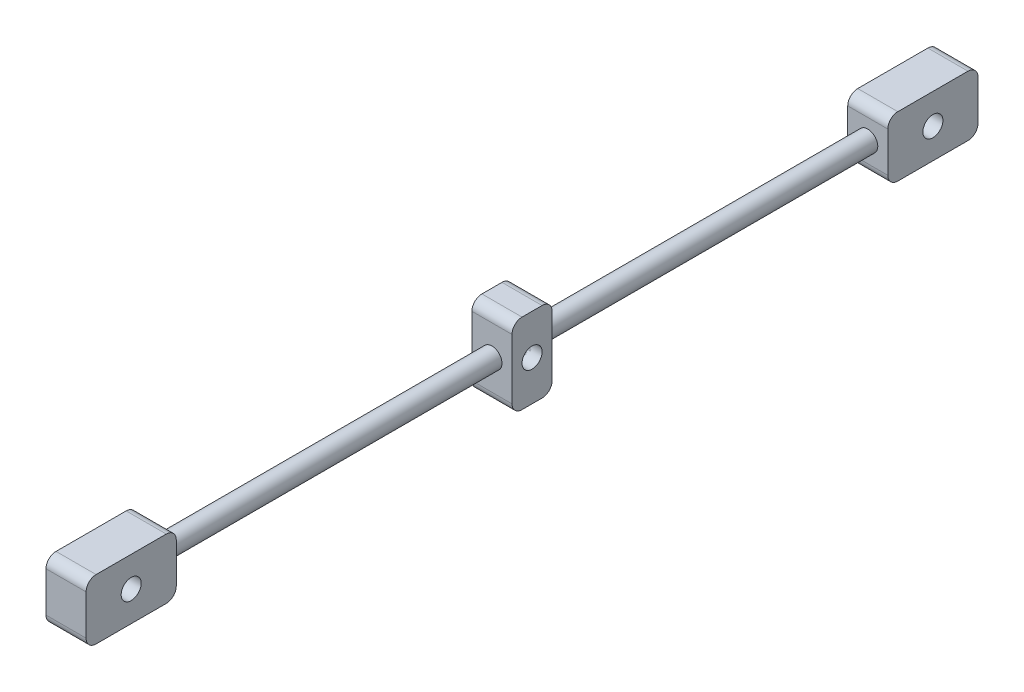
ISO-10303-21;
HEADER;
FILE_DESCRIPTION(('STEP AP214'),'2;1');
FILE_NAME('part.step','',(''),(''),'','','');
FILE_SCHEMA(('AUTOMOTIVE_DESIGN { 1 0 10303 214 1 1 1 1 }'));
ENDSEC;
DATA;
#1=APPLICATION_CONTEXT('core data for automotive mechanical design processes');
#2=APPLICATION_PROTOCOL_DEFINITION('international standard','automotive_design',2000,#1);
#3=PRODUCT_CONTEXT('',#1,'mechanical');
#4=PRODUCT('Part','Part','',(#3));
#5=PRODUCT_RELATED_PRODUCT_CATEGORY('part','',(#4));
#6=PRODUCT_DEFINITION_FORMATION('','',#4);
#7=PRODUCT_DEFINITION_CONTEXT('part definition',#1,'design');
#8=PRODUCT_DEFINITION('design','',#6,#7);
#9=PRODUCT_DEFINITION_SHAPE('','',#8);
#10=(LENGTH_UNIT() NAMED_UNIT(*) SI_UNIT(.MILLI.,.METRE.));
#11=(NAMED_UNIT(*) PLANE_ANGLE_UNIT() SI_UNIT($,.RADIAN.));
#12=(NAMED_UNIT(*) SI_UNIT($,.STERADIAN.) SOLID_ANGLE_UNIT());
#13=UNCERTAINTY_MEASURE_WITH_UNIT(LENGTH_MEASURE(1.E-05),#10,'distance_accuracy_value','');
#14=(GEOMETRIC_REPRESENTATION_CONTEXT(3) GLOBAL_UNCERTAINTY_ASSIGNED_CONTEXT((#13)) GLOBAL_UNIT_ASSIGNED_CONTEXT((#10,
#11,#12)) REPRESENTATION_CONTEXT('',''));
#15=CARTESIAN_POINT('',(0.,0.,0.));
#16=DIRECTION('',(0.,0.,1.));
#17=DIRECTION('',(1.,0.,0.));
#18=AXIS2_PLACEMENT_3D('',#15,#16,#17);
#19=CARTESIAN_POINT('',(0.,0.,400.));
#20=DIRECTION('',(0.,0.,-1.));
#21=DIRECTION('',(-1.,0.,0.));
#22=AXIS2_PLACEMENT_3D('',#19,#20,#21);
#23=CYLINDRICAL_SURFACE('',#22,10.);
#24=CARTESIAN_POINT('',(0.,0.,0.));
#25=DIRECTION('',(0.707106781186547,0.,-0.707106781186547));
#26=DIRECTION('',(-0.707106781186547,0.,-0.707106781186547));
#27=AXIS2_PLACEMENT_3D('',#24,#25,#26);
#28=ELLIPSE('',#27,14.1421356237309,10.);
#29=CARTESIAN_POINT('',(0.,-10.,0.));
#30=VERTEX_POINT('',#29);
#31=CARTESIAN_POINT('',(0.,10.,0.));
#32=VERTEX_POINT('',#31);
#33=EDGE_CURVE('E120',#30,#32,#28,.T.);
#34=ORIENTED_EDGE('',*,*,#33,.T.);
#35=CARTESIAN_POINT('',(0.,0.,0.));
#36=DIRECTION('',(-0.707106781186547,0.,-0.707106781186547));
#37=DIRECTION('',(0.707106781186547,0.,-0.707106781186547));
#38=AXIS2_PLACEMENT_3D('',#35,#36,#37);
#39=ELLIPSE('',#38,14.1421356237309,10.);
#40=EDGE_CURVE('E121',#32,#30,#39,.T.);
#41=ORIENTED_EDGE('',*,*,#40,.T.);
#42=EDGE_LOOP('',(#34,#41));
#43=FACE_BOUND('',#42,.T.);
#44=CARTESIAN_POINT('',(0.,0.,-355.));
#45=DIRECTION('',(0.,0.,1.));
#46=DIRECTION('',(1.,0.,0.));
#47=AXIS2_PLACEMENT_3D('',#44,#45,#46);
#48=CIRCLE('',#47,10.);
#49=CARTESIAN_POINT('',(10.,0.,-355.));
#50=VERTEX_POINT('',#49);
#51=EDGE_CURVE('E130',#50,#50,#48,.T.);
#52=ORIENTED_EDGE('',*,*,#51,.T.);
#53=EDGE_LOOP('',(#52));
#54=FACE_BOUND('',#53,.T.);
#55=ADVANCED_FACE('F47',(#43,#54),#23,.T.);
#56=CARTESIAN_POINT('',(-20.,-30.,-445.));
#57=DIRECTION('',(0.,-1.,0.));
#58=DIRECTION('',(0.,0.,-1.));
#59=AXIS2_PLACEMENT_3D('',#56,#57,#58);
#60=PLANE('',#59);
#61=DIRECTION('',(0.,0.,-1.));
#62=VECTOR('',#61,1.);
#63=CARTESIAN_POINT('',(-20.,-30.,-445.));
#64=LINE('',#63,#62);
#65=CARTESIAN_POINT('',(-20.,-30.,-365.));
#66=VERTEX_POINT('',#65);
#67=CARTESIAN_POINT('',(-20.,-30.,-435.));
#68=VERTEX_POINT('',#67);
#69=EDGE_CURVE('E128',#66,#68,#64,.T.);
#70=ORIENTED_EDGE('',*,*,#69,.T.);
#71=DIRECTION('',(1.,0.,0.));
#72=VECTOR('',#71,1.);
#73=CARTESIAN_POINT('',(-20.,-30.,-435.));
#74=LINE('',#73,#72);
#75=CARTESIAN_POINT('',(20.,-30.,-435.));
#76=VERTEX_POINT('',#75);
#77=EDGE_CURVE('E162',#68,#76,#74,.T.);
#78=ORIENTED_EDGE('',*,*,#77,.T.);
#79=DIRECTION('',(0.,0.,-1.));
#80=VECTOR('',#79,1.);
#81=CARTESIAN_POINT('',(20.,-30.,-445.));
#82=LINE('',#81,#80);
#83=CARTESIAN_POINT('',(20.,-30.,-365.));
#84=VERTEX_POINT('',#83);
#85=EDGE_CURVE('E148',#84,#76,#82,.T.);
#86=ORIENTED_EDGE('',*,*,#85,.F.);
#87=DIRECTION('',(1.,0.,0.));
#88=VECTOR('',#87,1.);
#89=CARTESIAN_POINT('',(-20.,-30.,-365.));
#90=LINE('',#89,#88);
#91=EDGE_CURVE('E161',#84,#66,#90,.F.);
#92=ORIENTED_EDGE('',*,*,#91,.T.);
#93=EDGE_LOOP('',(#70,#78,#86,#92));
#94=FACE_BOUND('',#93,.T.);
#95=ADVANCED_FACE('F218',(#94),#60,.T.);
#96=CARTESIAN_POINT('',(-20.,30.,-355.));
#97=DIRECTION('',(0.,0.,1.));
#98=DIRECTION('',(1.,0.,0.));
#99=AXIS2_PLACEMENT_3D('',#96,#97,#98);
#100=PLANE('',#99);
#101=ORIENTED_EDGE('',*,*,#51,.F.);
#102=EDGE_LOOP('',(#101));
#103=FACE_BOUND('',#102,.T.);
#104=DIRECTION('',(0.,-1.,0.));
#105=VECTOR('',#104,1.);
#106=CARTESIAN_POINT('',(20.,30.,-355.));
#107=LINE('',#106,#105);
#108=CARTESIAN_POINT('',(20.,20.,-355.));
#109=VERTEX_POINT('',#108);
#110=CARTESIAN_POINT('',(20.,-20.,-355.));
#111=VERTEX_POINT('',#110);
#112=EDGE_CURVE('E138',#109,#111,#107,.T.);
#113=ORIENTED_EDGE('',*,*,#112,.F.);
#114=DIRECTION('',(1.,0.,0.));
#115=VECTOR('',#114,1.);
#116=CARTESIAN_POINT('',(-20.,20.,-355.));
#117=LINE('',#116,#115);
#118=CARTESIAN_POINT('',(-20.,20.,-355.));
#119=VERTEX_POINT('',#118);
#120=EDGE_CURVE('E12',#109,#119,#117,.F.);
#121=ORIENTED_EDGE('',*,*,#120,.T.);
#122=DIRECTION('',(0.,-1.,0.));
#123=VECTOR('',#122,1.);
#124=CARTESIAN_POINT('',(-20.,30.,-355.));
#125=LINE('',#124,#123);
#126=CARTESIAN_POINT('',(-20.,-20.,-355.));
#127=VERTEX_POINT('',#126);
#128=EDGE_CURVE('E136',#119,#127,#125,.T.);
#129=ORIENTED_EDGE('',*,*,#128,.T.);
#130=DIRECTION('',(1.,0.,0.));
#131=VECTOR('',#130,1.);
#132=CARTESIAN_POINT('',(-20.,-20.,-355.));
#133=LINE('',#132,#131);
#134=EDGE_CURVE('E60',#127,#111,#133,.T.);
#135=ORIENTED_EDGE('',*,*,#134,.T.);
#136=EDGE_LOOP('',(#113,#121,#129,#135));
#137=FACE_BOUND('',#136,.T.);
#138=ADVANCED_FACE('F191',(#103,#137),#100,.T.);
#139=CARTESIAN_POINT('',(-20.,30.,-445.));
#140=DIRECTION('',(0.,1.,0.));
#141=DIRECTION('',(0.,0.,1.));
#142=AXIS2_PLACEMENT_3D('',#139,#140,#141);
#143=PLANE('',#142);
#144=DIRECTION('',(0.,0.,1.));
#145=VECTOR('',#144,1.);
#146=CARTESIAN_POINT('',(20.,30.,-445.));
#147=LINE('',#146,#145);
#148=CARTESIAN_POINT('',(20.,30.,-435.));
#149=VERTEX_POINT('',#148);
#150=CARTESIAN_POINT('',(20.,30.,-365.));
#151=VERTEX_POINT('',#150);
#152=EDGE_CURVE('E151',#149,#151,#147,.T.);
#153=ORIENTED_EDGE('',*,*,#152,.F.);
#154=DIRECTION('',(1.,0.,0.));
#155=VECTOR('',#154,1.);
#156=CARTESIAN_POINT('',(-20.,30.,-435.));
#157=LINE('',#156,#155);
#158=CARTESIAN_POINT('',(-20.,30.,-435.));
#159=VERTEX_POINT('',#158);
#160=EDGE_CURVE('E72',#149,#159,#157,.F.);
#161=ORIENTED_EDGE('',*,*,#160,.T.);
#162=DIRECTION('',(0.,0.,1.));
#163=VECTOR('',#162,1.);
#164=CARTESIAN_POINT('',(-20.,30.,-445.));
#165=LINE('',#164,#163);
#166=CARTESIAN_POINT('',(-20.,30.,-365.));
#167=VERTEX_POINT('',#166);
#168=EDGE_CURVE('E143',#159,#167,#165,.T.);
#169=ORIENTED_EDGE('',*,*,#168,.T.);
#170=DIRECTION('',(1.,0.,0.));
#171=VECTOR('',#170,1.);
#172=CARTESIAN_POINT('',(-20.,30.,-365.));
#173=LINE('',#172,#171);
#174=EDGE_CURVE('E186',#167,#151,#173,.T.);
#175=ORIENTED_EDGE('',*,*,#174,.T.);
#176=EDGE_LOOP('',(#153,#161,#169,#175));
#177=FACE_BOUND('',#176,.T.);
#178=ADVANCED_FACE('F201',(#177),#143,.T.);
#179=CARTESIAN_POINT('',(-20.,30.,-445.));
#180=DIRECTION('',(0.,0.,-1.));
#181=DIRECTION('',(-1.,0.,0.));
#182=AXIS2_PLACEMENT_3D('',#179,#180,#181);
#183=PLANE('',#182);
#184=DIRECTION('',(0.,1.,0.));
#185=VECTOR('',#184,1.);
#186=CARTESIAN_POINT('',(20.,30.,-445.));
#187=LINE('',#186,#185);
#188=CARTESIAN_POINT('',(20.,-20.,-445.));
#189=VERTEX_POINT('',#188);
#190=CARTESIAN_POINT('',(20.,20.,-445.));
#191=VERTEX_POINT('',#190);
#192=EDGE_CURVE('E152',#189,#191,#187,.T.);
#193=ORIENTED_EDGE('',*,*,#192,.F.);
#194=DIRECTION('',(1.,0.,0.));
#195=VECTOR('',#194,1.);
#196=CARTESIAN_POINT('',(-20.,-20.,-445.));
#197=LINE('',#196,#195);
#198=CARTESIAN_POINT('',(-20.,-20.,-445.));
#199=VERTEX_POINT('',#198);
#200=EDGE_CURVE('E180',#189,#199,#197,.F.);
#201=ORIENTED_EDGE('',*,*,#200,.T.);
#202=DIRECTION('',(0.,1.,0.));
#203=VECTOR('',#202,1.);
#204=CARTESIAN_POINT('',(-20.,30.,-445.));
#205=LINE('',#204,#203);
#206=CARTESIAN_POINT('',(-20.,20.,-445.));
#207=VERTEX_POINT('',#206);
#208=EDGE_CURVE('E141',#199,#207,#205,.T.);
#209=ORIENTED_EDGE('',*,*,#208,.T.);
#210=DIRECTION('',(1.,0.,0.));
#211=VECTOR('',#210,1.);
#212=CARTESIAN_POINT('',(-20.,20.,-445.));
#213=LINE('',#212,#211);
#214=EDGE_CURVE('E173',#207,#191,#213,.T.);
#215=ORIENTED_EDGE('',*,*,#214,.T.);
#216=EDGE_LOOP('',(#193,#201,#209,#215));
#217=FACE_BOUND('',#216,.T.);
#218=ADVANCED_FACE('F215',(#217),#183,.T.);
#219=CARTESIAN_POINT('',(-20.,0.,0.));
#220=DIRECTION('',(1.,0.,0.));
#221=DIRECTION('',(0.,0.,-1.));
#222=AXIS2_PLACEMENT_3D('',#219,#220,#221);
#223=PLANE('',#222);
#224=CARTESIAN_POINT('',(-20.,0.,-400.));
#225=DIRECTION('',(-1.,0.,0.));
#226=DIRECTION('',(0.,0.,1.));
#227=AXIS2_PLACEMENT_3D('',#224,#225,#226);
#228=CIRCLE('',#227,10.);
#229=CARTESIAN_POINT('',(-20.,0.,-390.));
#230=VERTEX_POINT('',#229);
#231=EDGE_CURVE('E135',#230,#230,#228,.T.);
#232=ORIENTED_EDGE('',*,*,#231,.F.);
#233=EDGE_LOOP('',(#232));
#234=FACE_BOUND('',#233,.T.);
#235=ORIENTED_EDGE('',*,*,#208,.F.);
#236=CARTESIAN_POINT('',(-20.,-20.,-435.));
#237=DIRECTION('',(1.,0.,0.));
#238=DIRECTION('',(0.,0.,-1.));
#239=AXIS2_PLACEMENT_3D('',#236,#237,#238);
#240=CIRCLE('',#239,10.);
#241=EDGE_CURVE('E184',#199,#68,#240,.F.);
#242=ORIENTED_EDGE('',*,*,#241,.T.);
#243=ORIENTED_EDGE('',*,*,#69,.F.);
#244=CARTESIAN_POINT('',(-20.,-20.,-365.));
#245=DIRECTION('',(1.,0.,0.));
#246=DIRECTION('',(0.,0.,-1.));
#247=AXIS2_PLACEMENT_3D('',#244,#245,#246);
#248=CIRCLE('',#247,10.);
#249=EDGE_CURVE('E177',#66,#127,#248,.F.);
#250=ORIENTED_EDGE('',*,*,#249,.T.);
#251=ORIENTED_EDGE('',*,*,#128,.F.);
#252=CARTESIAN_POINT('',(-20.,20.,-365.));
#253=DIRECTION('',(1.,0.,0.));
#254=DIRECTION('',(0.,0.,-1.));
#255=AXIS2_PLACEMENT_3D('',#252,#253,#254);
#256=CIRCLE('',#255,10.);
#257=EDGE_CURVE('E63',#119,#167,#256,.F.);
#258=ORIENTED_EDGE('',*,*,#257,.T.);
#259=ORIENTED_EDGE('',*,*,#168,.F.);
#260=CARTESIAN_POINT('',(-20.,20.,-435.));
#261=DIRECTION('',(1.,0.,0.));
#262=DIRECTION('',(0.,0.,-1.));
#263=AXIS2_PLACEMENT_3D('',#260,#261,#262);
#264=CIRCLE('',#263,10.);
#265=EDGE_CURVE('E185',#159,#207,#264,.F.);
#266=ORIENTED_EDGE('',*,*,#265,.T.);
#267=EDGE_LOOP('',(#235,#242,#243,#250,#251,#258,#259,#266));
#268=FACE_BOUND('',#267,.T.);
#269=ADVANCED_FACE('F206',(#234,#268),#223,.F.);
#270=CARTESIAN_POINT('',(20.,0.,0.));
#271=DIRECTION('',(1.,0.,0.));
#272=DIRECTION('',(0.,0.,-1.));
#273=AXIS2_PLACEMENT_3D('',#270,#271,#272);
#274=PLANE('',#273);
#275=CARTESIAN_POINT('',(20.,0.,-400.));
#276=DIRECTION('',(1.,0.,0.));
#277=DIRECTION('',(0.,0.,-1.));
#278=AXIS2_PLACEMENT_3D('',#275,#276,#277);
#279=CIRCLE('',#278,10.);
#280=CARTESIAN_POINT('',(20.,0.,-410.));
#281=VERTEX_POINT('',#280);
#282=EDGE_CURVE('E134',#281,#281,#279,.T.);
#283=ORIENTED_EDGE('',*,*,#282,.F.);
#284=EDGE_LOOP('',(#283));
#285=FACE_BOUND('',#284,.T.);
#286=ORIENTED_EDGE('',*,*,#85,.T.);
#287=CARTESIAN_POINT('',(20.,-20.,-435.));
#288=DIRECTION('',(1.,0.,0.));
#289=DIRECTION('',(0.,0.,-1.));
#290=AXIS2_PLACEMENT_3D('',#287,#288,#289);
#291=CIRCLE('',#290,10.);
#292=EDGE_CURVE('E172',#76,#189,#291,.T.);
#293=ORIENTED_EDGE('',*,*,#292,.T.);
#294=ORIENTED_EDGE('',*,*,#192,.T.);
#295=CARTESIAN_POINT('',(20.,20.,-435.));
#296=DIRECTION('',(1.,0.,0.));
#297=DIRECTION('',(0.,0.,-1.));
#298=AXIS2_PLACEMENT_3D('',#295,#296,#297);
#299=CIRCLE('',#298,10.);
#300=EDGE_CURVE('E168',#191,#149,#299,.T.);
#301=ORIENTED_EDGE('',*,*,#300,.T.);
#302=ORIENTED_EDGE('',*,*,#152,.T.);
#303=CARTESIAN_POINT('',(20.,20.,-365.));
#304=DIRECTION('',(1.,0.,0.));
#305=DIRECTION('',(0.,0.,-1.));
#306=AXIS2_PLACEMENT_3D('',#303,#304,#305);
#307=CIRCLE('',#306,10.);
#308=EDGE_CURVE('E169',#151,#109,#307,.T.);
#309=ORIENTED_EDGE('',*,*,#308,.T.);
#310=ORIENTED_EDGE('',*,*,#112,.T.);
#311=CARTESIAN_POINT('',(20.,-20.,-365.));
#312=DIRECTION('',(1.,0.,0.));
#313=DIRECTION('',(0.,0.,-1.));
#314=AXIS2_PLACEMENT_3D('',#311,#312,#313);
#315=CIRCLE('',#314,10.);
#316=EDGE_CURVE('E167',#111,#84,#315,.T.);
#317=ORIENTED_EDGE('',*,*,#316,.T.);
#318=EDGE_LOOP('',(#286,#293,#294,#301,#302,#309,#310,#317));
#319=FACE_BOUND('',#318,.T.);
#320=ADVANCED_FACE('F196',(#285,#319),#274,.T.);
#321=CARTESIAN_POINT('',(34.,0.,-400.));
#322=DIRECTION('',(-1.,0.,0.));
#323=DIRECTION('',(0.,0.,1.));
#324=AXIS2_PLACEMENT_3D('',#321,#322,#323);
#325=CYLINDRICAL_SURFACE('',#324,10.);
#326=ORIENTED_EDGE('',*,*,#282,.T.);
#327=EDGE_LOOP('',(#326));
#328=FACE_BOUND('',#327,.T.);
#329=ORIENTED_EDGE('',*,*,#231,.T.);
#330=EDGE_LOOP('',(#329));
#331=FACE_BOUND('',#330,.T.);
#332=ADVANCED_FACE('F234',(#328,#331),#325,.F.);
#333=CARTESIAN_POINT('',(34.,0.,0.));
#334=DIRECTION('',(-1.,0.,0.));
#335=DIRECTION('',(0.,0.,1.));
#336=AXIS2_PLACEMENT_3D('',#333,#334,#335);
#337=CYLINDRICAL_SURFACE('',#336,10.);
#338=ORIENTED_EDGE('',*,*,#33,.F.);
#339=ORIENTED_EDGE('',*,*,#40,.F.);
#340=EDGE_LOOP('',(#338,#339));
#341=FACE_BOUND('',#340,.T.);
#342=ADVANCED_FACE('F125',(#341),#337,.F.);
#343=CARTESIAN_POINT('',(-20.,-20.,-435.));
#344=DIRECTION('',(1.,0.,0.));
#345=DIRECTION('',(0.,0.,-1.));
#346=AXIS2_PLACEMENT_3D('',#343,#344,#345);
#347=CYLINDRICAL_SURFACE('',#346,10.);
#348=ORIENTED_EDGE('',*,*,#241,.F.);
#349=ORIENTED_EDGE('',*,*,#200,.F.);
#350=ORIENTED_EDGE('',*,*,#292,.F.);
#351=ORIENTED_EDGE('',*,*,#77,.F.);
#352=EDGE_LOOP('',(#348,#349,#350,#351));
#353=FACE_BOUND('',#352,.T.);
#354=ADVANCED_FACE('F220',(#353),#347,.T.);
#355=CARTESIAN_POINT('',(-20.,20.,-435.));
#356=DIRECTION('',(1.,0.,0.));
#357=DIRECTION('',(0.,0.,-1.));
#358=AXIS2_PLACEMENT_3D('',#355,#356,#357);
#359=CYLINDRICAL_SURFACE('',#358,10.);
#360=ORIENTED_EDGE('',*,*,#265,.F.);
#361=ORIENTED_EDGE('',*,*,#160,.F.);
#362=ORIENTED_EDGE('',*,*,#300,.F.);
#363=ORIENTED_EDGE('',*,*,#214,.F.);
#364=EDGE_LOOP('',(#360,#361,#362,#363));
#365=FACE_BOUND('',#364,.T.);
#366=ADVANCED_FACE('F207',(#365),#359,.T.);
#367=CARTESIAN_POINT('',(-20.,20.,-365.));
#368=DIRECTION('',(1.,0.,0.));
#369=DIRECTION('',(0.,0.,-1.));
#370=AXIS2_PLACEMENT_3D('',#367,#368,#369);
#371=CYLINDRICAL_SURFACE('',#370,10.);
#372=ORIENTED_EDGE('',*,*,#257,.F.);
#373=ORIENTED_EDGE('',*,*,#120,.F.);
#374=ORIENTED_EDGE('',*,*,#308,.F.);
#375=ORIENTED_EDGE('',*,*,#174,.F.);
#376=EDGE_LOOP('',(#372,#373,#374,#375));
#377=FACE_BOUND('',#376,.T.);
#378=ADVANCED_FACE('F205',(#377),#371,.T.);
#379=CARTESIAN_POINT('',(-20.,-20.,-365.));
#380=DIRECTION('',(1.,0.,0.));
#381=DIRECTION('',(0.,0.,-1.));
#382=AXIS2_PLACEMENT_3D('',#379,#380,#381);
#383=CYLINDRICAL_SURFACE('',#382,10.);
#384=ORIENTED_EDGE('',*,*,#249,.F.);
#385=ORIENTED_EDGE('',*,*,#91,.F.);
#386=ORIENTED_EDGE('',*,*,#316,.F.);
#387=ORIENTED_EDGE('',*,*,#134,.F.);
#388=EDGE_LOOP('',(#384,#385,#386,#387));
#389=FACE_BOUND('',#388,.T.);
#390=ADVANCED_FACE('F51',(#389),#383,.T.);
#391=CLOSED_SHELL('',(#55,#95,#138,#178,#218,#269,#320,#332,#342,#354,#366,#378,#390));
#392=MANIFOLD_SOLID_BREP('B2',#391);
#393=CARTESIAN_POINT('',(-20.,-40.,20.));
#394=DIRECTION('',(0.,-1.,0.));
#395=DIRECTION('',(0.,0.,-1.));
#396=AXIS2_PLACEMENT_3D('',#393,#394,#395);
#397=PLANE('',#396);
#398=DIRECTION('',(0.,0.,-1.));
#399=VECTOR('',#398,1.);
#400=CARTESIAN_POINT('',(-20.,-40.,20.));
#401=LINE('',#400,#399);
#402=CARTESIAN_POINT('',(-20.,-40.,9.99999999999999));
#403=VERTEX_POINT('',#402);
#404=CARTESIAN_POINT('',(-20.,-40.,-10.));
#405=VERTEX_POINT('',#404);
#406=EDGE_CURVE('E480',#403,#405,#401,.T.);
#407=ORIENTED_EDGE('',*,*,#406,.T.);
#408=DIRECTION('',(1.,0.,0.));
#409=VECTOR('',#408,1.);
#410=CARTESIAN_POINT('',(-20.,-40.,-10.));
#411=LINE('',#410,#409);
#412=CARTESIAN_POINT('',(20.,-40.,-10.));
#413=VERTEX_POINT('',#412);
#414=EDGE_CURVE('E424',#405,#413,#411,.T.);
#415=ORIENTED_EDGE('',*,*,#414,.T.);
#416=DIRECTION('',(0.,0.,-1.));
#417=VECTOR('',#416,1.);
#418=CARTESIAN_POINT('',(20.,-40.,20.));
#419=LINE('',#418,#417);
#420=CARTESIAN_POINT('',(20.,-40.,9.99999999999999));
#421=VERTEX_POINT('',#420);
#422=EDGE_CURVE('E418',#421,#413,#419,.T.);
#423=ORIENTED_EDGE('',*,*,#422,.F.);
#424=DIRECTION('',(1.,0.,0.));
#425=VECTOR('',#424,1.);
#426=CARTESIAN_POINT('',(-20.,-40.,9.99999999999999));
#427=LINE('',#426,#425);
#428=EDGE_CURVE('E427',#421,#403,#427,.F.);
#429=ORIENTED_EDGE('',*,*,#428,.T.);
#430=EDGE_LOOP('',(#407,#415,#423,#429));
#431=FACE_BOUND('',#430,.T.);
#432=ADVANCED_FACE('F350',(#431),#397,.T.);
#433=CARTESIAN_POINT('',(-20.,40.,20.));
#434=DIRECTION('',(0.,0.,1.));
#435=DIRECTION('',(0.,-1.,0.));
#436=AXIS2_PLACEMENT_3D('',#433,#434,#435);
#437=PLANE('',#436);
#438=DIRECTION('',(0.,-1.,0.));
#439=VECTOR('',#438,1.);
#440=CARTESIAN_POINT('',(20.,40.,20.));
#441=LINE('',#440,#439);
#442=CARTESIAN_POINT('',(20.,30.,20.));
#443=VERTEX_POINT('',#442);
#444=CARTESIAN_POINT('',(20.,-30.,20.));
#445=VERTEX_POINT('',#444);
#446=EDGE_CURVE('E416',#443,#445,#441,.T.);
#447=ORIENTED_EDGE('',*,*,#446,.F.);
#448=DIRECTION('',(1.,0.,0.));
#449=VECTOR('',#448,1.);
#450=CARTESIAN_POINT('',(-20.,30.,20.));
#451=LINE('',#450,#449);
#452=CARTESIAN_POINT('',(-20.,30.,20.));
#453=VERTEX_POINT('',#452);
#454=EDGE_CURVE('E50',#443,#453,#451,.F.);
#455=ORIENTED_EDGE('',*,*,#454,.T.);
#456=DIRECTION('',(0.,-1.,0.));
#457=VECTOR('',#456,1.);
#458=CARTESIAN_POINT('',(-20.,40.,20.));
#459=LINE('',#458,#457);
#460=CARTESIAN_POINT('',(-20.,-30.,20.));
#461=VERTEX_POINT('',#460);
#462=EDGE_CURVE('E440',#453,#461,#459,.T.);
#463=ORIENTED_EDGE('',*,*,#462,.T.);
#464=DIRECTION('',(1.,0.,0.));
#465=VECTOR('',#464,1.);
#466=CARTESIAN_POINT('',(-20.,-30.,20.));
#467=LINE('',#466,#465);
#468=EDGE_CURVE('E355',#461,#445,#467,.T.);
#469=ORIENTED_EDGE('',*,*,#468,.T.);
#470=EDGE_LOOP('',(#447,#455,#463,#469));
#471=FACE_BOUND('',#470,.T.);
#472=ADVANCED_FACE('F465',(#471),#437,.T.);
#473=CARTESIAN_POINT('',(-20.,40.,20.));
#474=DIRECTION('',(0.,1.,0.));
#475=DIRECTION('',(0.,0.,1.));
#476=AXIS2_PLACEMENT_3D('',#473,#474,#475);
#477=PLANE('',#476);
#478=DIRECTION('',(0.,0.,1.));
#479=VECTOR('',#478,1.);
#480=CARTESIAN_POINT('',(20.,40.,20.));
#481=LINE('',#480,#479);
#482=CARTESIAN_POINT('',(20.,40.,-10.));
#483=VERTEX_POINT('',#482);
#484=CARTESIAN_POINT('',(20.,40.,10.));
#485=VERTEX_POINT('',#484);
#486=EDGE_CURVE('E475',#483,#485,#481,.T.);
#487=ORIENTED_EDGE('',*,*,#486,.F.);
#488=DIRECTION('',(1.,0.,0.));
#489=VECTOR('',#488,1.);
#490=CARTESIAN_POINT('',(-20.,40.,-10.));
#491=LINE('',#490,#489);
#492=CARTESIAN_POINT('',(-20.,40.,-10.));
#493=VERTEX_POINT('',#492);
#494=EDGE_CURVE('E369',#483,#493,#491,.F.);
#495=ORIENTED_EDGE('',*,*,#494,.T.);
#496=DIRECTION('',(0.,0.,1.));
#497=VECTOR('',#496,1.);
#498=CARTESIAN_POINT('',(-20.,40.,20.));
#499=LINE('',#498,#497);
#500=CARTESIAN_POINT('',(-20.,40.,10.));
#501=VERTEX_POINT('',#500);
#502=EDGE_CURVE('E442',#493,#501,#499,.T.);
#503=ORIENTED_EDGE('',*,*,#502,.T.);
#504=DIRECTION('',(1.,0.,0.));
#505=VECTOR('',#504,1.);
#506=CARTESIAN_POINT('',(-20.,40.,10.));
#507=LINE('',#506,#505);
#508=EDGE_CURVE('E461',#501,#485,#507,.T.);
#509=ORIENTED_EDGE('',*,*,#508,.T.);
#510=EDGE_LOOP('',(#487,#495,#503,#509));
#511=FACE_BOUND('',#510,.T.);
#512=ADVANCED_FACE('F471',(#511),#477,.T.);
#513=CARTESIAN_POINT('',(-20.,40.,-20.));
#514=DIRECTION('',(0.,0.,-1.));
#515=DIRECTION('',(0.,1.,0.));
#516=AXIS2_PLACEMENT_3D('',#513,#514,#515);
#517=PLANE('',#516);
#518=DIRECTION('',(0.,1.,0.));
#519=VECTOR('',#518,1.);
#520=CARTESIAN_POINT('',(20.,40.,-20.));
#521=LINE('',#520,#519);
#522=CARTESIAN_POINT('',(20.,-30.,-20.));
#523=VERTEX_POINT('',#522);
#524=CARTESIAN_POINT('',(20.,30.,-20.));
#525=VERTEX_POINT('',#524);
#526=EDGE_CURVE('E435',#523,#525,#521,.T.);
#527=ORIENTED_EDGE('',*,*,#526,.F.);
#528=DIRECTION('',(1.,0.,0.));
#529=VECTOR('',#528,1.);
#530=CARTESIAN_POINT('',(-20.,-30.,-20.));
#531=LINE('',#530,#529);
#532=CARTESIAN_POINT('',(-20.,-30.,-20.));
#533=VERTEX_POINT('',#532);
#534=EDGE_CURVE('E451',#523,#533,#531,.F.);
#535=ORIENTED_EDGE('',*,*,#534,.T.);
#536=DIRECTION('',(0.,1.,0.));
#537=VECTOR('',#536,1.);
#538=CARTESIAN_POINT('',(-20.,40.,-20.));
#539=LINE('',#538,#537);
#540=CARTESIAN_POINT('',(-20.,30.,-20.));
#541=VERTEX_POINT('',#540);
#542=EDGE_CURVE('E485',#533,#541,#539,.T.);
#543=ORIENTED_EDGE('',*,*,#542,.T.);
#544=DIRECTION('',(1.,0.,0.));
#545=VECTOR('',#544,1.);
#546=CARTESIAN_POINT('',(-20.,30.,-20.));
#547=LINE('',#546,#545);
#548=EDGE_CURVE('E450',#541,#525,#547,.T.);
#549=ORIENTED_EDGE('',*,*,#548,.T.);
#550=EDGE_LOOP('',(#527,#535,#543,#549));
#551=FACE_BOUND('',#550,.T.);
#552=ADVANCED_FACE('F488',(#551),#517,.T.);
#553=CARTESIAN_POINT('',(-20.,0.,0.));
#554=DIRECTION('',(-1.,0.,0.));
#555=DIRECTION('',(0.,0.,1.));
#556=AXIS2_PLACEMENT_3D('',#553,#554,#555);
#557=PLANE('',#556);
#558=CARTESIAN_POINT('',(-20.,0.,0.));
#559=DIRECTION('',(-1.,0.,0.));
#560=DIRECTION('',(0.,0.,1.));
#561=AXIS2_PLACEMENT_3D('',#558,#559,#560);
#562=CIRCLE('',#561,10.);
#563=CARTESIAN_POINT('',(-20.,0.,10.));
#564=VERTEX_POINT('',#563);
#565=EDGE_CURVE('E526',#564,#564,#562,.T.);
#566=ORIENTED_EDGE('',*,*,#565,.F.);
#567=EDGE_LOOP('',(#566));
#568=FACE_BOUND('',#567,.T.);
#569=ORIENTED_EDGE('',*,*,#542,.F.);
#570=CARTESIAN_POINT('',(-20.,-30.,-10.));
#571=DIRECTION('',(-1.,0.,0.));
#572=DIRECTION('',(0.,0.,1.));
#573=AXIS2_PLACEMENT_3D('',#570,#571,#572);
#574=CIRCLE('',#573,10.);
#575=EDGE_CURVE('E459',#533,#405,#574,.T.);
#576=ORIENTED_EDGE('',*,*,#575,.T.);
#577=ORIENTED_EDGE('',*,*,#406,.F.);
#578=CARTESIAN_POINT('',(-20.,-30.,9.99999999999999));
#579=DIRECTION('',(-1.,0.,0.));
#580=DIRECTION('',(0.,0.,1.));
#581=AXIS2_PLACEMENT_3D('',#578,#579,#580);
#582=CIRCLE('',#581,10.);
#583=EDGE_CURVE('E436',#403,#461,#582,.T.);
#584=ORIENTED_EDGE('',*,*,#583,.T.);
#585=ORIENTED_EDGE('',*,*,#462,.F.);
#586=CARTESIAN_POINT('',(-20.,30.,10.));
#587=DIRECTION('',(-1.,0.,0.));
#588=DIRECTION('',(0.,0.,1.));
#589=AXIS2_PLACEMENT_3D('',#586,#587,#588);
#590=CIRCLE('',#589,10.);
#591=EDGE_CURVE('E362',#453,#501,#590,.T.);
#592=ORIENTED_EDGE('',*,*,#591,.T.);
#593=ORIENTED_EDGE('',*,*,#502,.F.);
#594=CARTESIAN_POINT('',(-20.,30.,-10.));
#595=DIRECTION('',(-1.,0.,0.));
#596=DIRECTION('',(0.,0.,1.));
#597=AXIS2_PLACEMENT_3D('',#594,#595,#596);
#598=CIRCLE('',#597,10.);
#599=EDGE_CURVE('E460',#493,#541,#598,.T.);
#600=ORIENTED_EDGE('',*,*,#599,.T.);
#601=EDGE_LOOP('',(#569,#576,#577,#584,#585,#592,#593,#600));
#602=FACE_BOUND('',#601,.T.);
#603=ADVANCED_FACE('F466',(#568,#602),#557,.T.);
#604=CARTESIAN_POINT('',(20.,0.,0.));
#605=DIRECTION('',(-1.,0.,0.));
#606=DIRECTION('',(0.,0.,1.));
#607=AXIS2_PLACEMENT_3D('',#604,#605,#606);
#608=PLANE('',#607);
#609=CARTESIAN_POINT('',(20.,0.,0.));
#610=DIRECTION('',(-1.,0.,0.));
#611=DIRECTION('',(0.,0.,1.));
#612=AXIS2_PLACEMENT_3D('',#609,#610,#611);
#613=CIRCLE('',#612,10.);
#614=CARTESIAN_POINT('',(20.,0.,10.));
#615=VERTEX_POINT('',#614);
#616=EDGE_CURVE('E433',#615,#615,#613,.T.);
#617=ORIENTED_EDGE('',*,*,#616,.T.);
#618=EDGE_LOOP('',(#617));
#619=FACE_BOUND('',#618,.T.);
#620=ORIENTED_EDGE('',*,*,#422,.T.);
#621=CARTESIAN_POINT('',(20.,-30.,-10.));
#622=DIRECTION('',(-1.,0.,0.));
#623=DIRECTION('',(0.,0.,1.));
#624=AXIS2_PLACEMENT_3D('',#621,#622,#623);
#625=CIRCLE('',#624,10.);
#626=EDGE_CURVE('E449',#413,#523,#625,.F.);
#627=ORIENTED_EDGE('',*,*,#626,.T.);
#628=ORIENTED_EDGE('',*,*,#526,.T.);
#629=CARTESIAN_POINT('',(20.,30.,-10.));
#630=DIRECTION('',(-1.,0.,0.));
#631=DIRECTION('',(0.,0.,1.));
#632=AXIS2_PLACEMENT_3D('',#629,#630,#631);
#633=CIRCLE('',#632,10.);
#634=EDGE_CURVE('E446',#525,#483,#633,.F.);
#635=ORIENTED_EDGE('',*,*,#634,.T.);
#636=ORIENTED_EDGE('',*,*,#486,.T.);
#637=CARTESIAN_POINT('',(20.,30.,10.));
#638=DIRECTION('',(-1.,0.,0.));
#639=DIRECTION('',(0.,0.,1.));
#640=AXIS2_PLACEMENT_3D('',#637,#638,#639);
#641=CIRCLE('',#640,10.);
#642=EDGE_CURVE('E421',#485,#443,#641,.F.);
#643=ORIENTED_EDGE('',*,*,#642,.T.);
#644=ORIENTED_EDGE('',*,*,#446,.T.);
#645=CARTESIAN_POINT('',(20.,-30.,9.99999999999999));
#646=DIRECTION('',(-1.,0.,0.));
#647=DIRECTION('',(0.,0.,1.));
#648=AXIS2_PLACEMENT_3D('',#645,#646,#647);
#649=CIRCLE('',#648,10.);
#650=EDGE_CURVE('E411',#445,#421,#649,.F.);
#651=ORIENTED_EDGE('',*,*,#650,.T.);
#652=EDGE_LOOP('',(#620,#627,#628,#635,#636,#643,#644,#651));
#653=FACE_BOUND('',#652,.T.);
#654=ADVANCED_FACE('F414',(#619,#653),#608,.F.);
#655=CARTESIAN_POINT('',(34.,0.,0.));
#656=DIRECTION('',(-1.,0.,0.));
#657=DIRECTION('',(0.,0.,1.));
#658=AXIS2_PLACEMENT_3D('',#655,#656,#657);
#659=CYLINDRICAL_SURFACE('',#658,10.);
#660=ORIENTED_EDGE('',*,*,#565,.T.);
#661=EDGE_LOOP('',(#660));
#662=FACE_BOUND('',#661,.T.);
#663=ORIENTED_EDGE('',*,*,#616,.F.);
#664=EDGE_LOOP('',(#663));
#665=FACE_BOUND('',#664,.T.);
#666=ADVANCED_FACE('F501',(#662,#665),#659,.F.);
#667=CARTESIAN_POINT('',(-20.,-30.,-10.));
#668=DIRECTION('',(1.,0.,0.));
#669=DIRECTION('',(0.,0.,-1.));
#670=AXIS2_PLACEMENT_3D('',#667,#668,#669);
#671=CYLINDRICAL_SURFACE('',#670,10.);
#672=ORIENTED_EDGE('',*,*,#575,.F.);
#673=ORIENTED_EDGE('',*,*,#534,.F.);
#674=ORIENTED_EDGE('',*,*,#626,.F.);
#675=ORIENTED_EDGE('',*,*,#414,.F.);
#676=EDGE_LOOP('',(#672,#673,#674,#675));
#677=FACE_BOUND('',#676,.T.);
#678=ADVANCED_FACE('F494',(#677),#671,.T.);
#679=CARTESIAN_POINT('',(-20.,30.,-10.));
#680=DIRECTION('',(1.,0.,0.));
#681=DIRECTION('',(0.,0.,-1.));
#682=AXIS2_PLACEMENT_3D('',#679,#680,#681);
#683=CYLINDRICAL_SURFACE('',#682,10.);
#684=ORIENTED_EDGE('',*,*,#599,.F.);
#685=ORIENTED_EDGE('',*,*,#494,.F.);
#686=ORIENTED_EDGE('',*,*,#634,.F.);
#687=ORIENTED_EDGE('',*,*,#548,.F.);
#688=EDGE_LOOP('',(#684,#685,#686,#687));
#689=FACE_BOUND('',#688,.T.);
#690=ADVANCED_FACE('F492',(#689),#683,.T.);
#691=CARTESIAN_POINT('',(-20.,30.,10.));
#692=DIRECTION('',(1.,0.,0.));
#693=DIRECTION('',(0.,0.,-1.));
#694=AXIS2_PLACEMENT_3D('',#691,#692,#693);
#695=CYLINDRICAL_SURFACE('',#694,10.);
#696=ORIENTED_EDGE('',*,*,#591,.F.);
#697=ORIENTED_EDGE('',*,*,#454,.F.);
#698=ORIENTED_EDGE('',*,*,#642,.F.);
#699=ORIENTED_EDGE('',*,*,#508,.F.);
#700=EDGE_LOOP('',(#696,#697,#698,#699));
#701=FACE_BOUND('',#700,.T.);
#702=ADVANCED_FACE('F473',(#701),#695,.T.);
#703=CARTESIAN_POINT('',(-20.,-30.,9.99999999999999));
#704=DIRECTION('',(1.,0.,0.));
#705=DIRECTION('',(0.,0.,-1.));
#706=AXIS2_PLACEMENT_3D('',#703,#704,#705);
#707=CYLINDRICAL_SURFACE('',#706,10.);
#708=ORIENTED_EDGE('',*,*,#583,.F.);
#709=ORIENTED_EDGE('',*,*,#428,.F.);
#710=ORIENTED_EDGE('',*,*,#650,.F.);
#711=ORIENTED_EDGE('',*,*,#468,.F.);
#712=EDGE_LOOP('',(#708,#709,#710,#711));
#713=FACE_BOUND('',#712,.T.);
#714=ADVANCED_FACE('F349',(#713),#707,.T.);
#715=CLOSED_SHELL('',(#432,#472,#512,#552,#603,#654,#666,#678,#690,#702,#714));
#716=MANIFOLD_SOLID_BREP('B6',#715);
#717=CARTESIAN_POINT('',(34.,0.,400.));
#718=DIRECTION('',(-1.,0.,0.));
#719=DIRECTION('',(0.,0.,1.));
#720=AXIS2_PLACEMENT_3D('',#717,#718,#719);
#721=CYLINDRICAL_SURFACE('',#720,10.);
#722=CARTESIAN_POINT('',(20.,0.,400.));
#723=DIRECTION('',(1.,0.,0.));
#724=DIRECTION('',(0.,0.,-1.));
#725=AXIS2_PLACEMENT_3D('',#722,#723,#724);
#726=CIRCLE('',#725,10.);
#727=CARTESIAN_POINT('',(20.,0.,390.));
#728=VERTEX_POINT('',#727);
#729=EDGE_CURVE('E744',#728,#728,#726,.T.);
#730=ORIENTED_EDGE('',*,*,#729,.T.);
#731=EDGE_LOOP('',(#730));
#732=FACE_BOUND('',#731,.T.);
#733=CARTESIAN_POINT('',(-20.,0.,400.));
#734=DIRECTION('',(-1.,0.,0.));
#735=DIRECTION('',(0.,0.,-1.));
#736=AXIS2_PLACEMENT_3D('',#733,#734,#735);
#737=CIRCLE('',#736,10.);
#738=CARTESIAN_POINT('',(-20.,0.,390.));
#739=VERTEX_POINT('',#738);
#740=EDGE_CURVE('E747',#739,#739,#737,.T.);
#741=ORIENTED_EDGE('',*,*,#740,.T.);
#742=EDGE_LOOP('',(#741));
#743=FACE_BOUND('',#742,.T.);
#744=ADVANCED_FACE('F596',(#732,#743),#721,.F.);
#745=CARTESIAN_POINT('',(-20.,30.,445.));
#746=DIRECTION('',(0.,0.,-1.));
#747=DIRECTION('',(-1.,0.,0.));
#748=AXIS2_PLACEMENT_3D('',#745,#746,#747);
#749=PLANE('',#748);
#750=DIRECTION('',(0.,1.,0.));
#751=VECTOR('',#750,1.);
#752=CARTESIAN_POINT('',(-20.,30.,445.));
#753=LINE('',#752,#751);
#754=CARTESIAN_POINT('',(-20.,-20.,445.));
#755=VERTEX_POINT('',#754);
#756=CARTESIAN_POINT('',(-20.,20.,445.));
#757=VERTEX_POINT('',#756);
#758=EDGE_CURVE('E715',#755,#757,#753,.T.);
#759=ORIENTED_EDGE('',*,*,#758,.F.);
#760=DIRECTION('',(1.,0.,0.));
#761=VECTOR('',#760,1.);
#762=CARTESIAN_POINT('',(-20.,-20.,445.));
#763=LINE('',#762,#761);
#764=CARTESIAN_POINT('',(20.,-20.,445.));
#765=VERTEX_POINT('',#764);
#766=EDGE_CURVE('E344',#755,#765,#763,.T.);
#767=ORIENTED_EDGE('',*,*,#766,.T.);
#768=DIRECTION('',(0.,1.,0.));
#769=VECTOR('',#768,1.);
#770=CARTESIAN_POINT('',(20.,30.,445.));
#771=LINE('',#770,#769);
#772=CARTESIAN_POINT('',(20.,20.,445.));
#773=VERTEX_POINT('',#772);
#774=EDGE_CURVE('E714',#765,#773,#771,.T.);
#775=ORIENTED_EDGE('',*,*,#774,.T.);
#776=DIRECTION('',(1.,0.,0.));
#777=VECTOR('',#776,1.);
#778=CARTESIAN_POINT('',(-20.,20.,445.));
#779=LINE('',#778,#777);
#780=EDGE_CURVE('E603',#773,#757,#779,.F.);
#781=ORIENTED_EDGE('',*,*,#780,.T.);
#782=EDGE_LOOP('',(#759,#767,#775,#781));
#783=FACE_BOUND('',#782,.T.);
#784=ADVANCED_FACE('F711',(#783),#749,.F.);
#785=CARTESIAN_POINT('',(-20.,0.,0.));
#786=DIRECTION('',(1.,0.,0.));
#787=DIRECTION('',(0.,0.,1.));
#788=AXIS2_PLACEMENT_3D('',#785,#786,#787);
#789=PLANE('',#788);
#790=ORIENTED_EDGE('',*,*,#740,.F.);
#791=EDGE_LOOP('',(#790));
#792=FACE_BOUND('',#791,.T.);
#793=DIRECTION('',(0.,-1.,0.));
#794=VECTOR('',#793,1.);
#795=CARTESIAN_POINT('',(-20.,30.,355.));
#796=LINE('',#795,#794);
#797=CARTESIAN_POINT('',(-20.,20.,355.));
#798=VERTEX_POINT('',#797);
#799=CARTESIAN_POINT('',(-20.,-20.,355.));
#800=VERTEX_POINT('',#799);
#801=EDGE_CURVE('E743',#798,#800,#796,.T.);
#802=ORIENTED_EDGE('',*,*,#801,.T.);
#803=CARTESIAN_POINT('',(-20.,-20.,365.));
#804=DIRECTION('',(1.,0.,0.));
#805=DIRECTION('',(0.,0.,-1.));
#806=AXIS2_PLACEMENT_3D('',#803,#804,#805);
#807=CIRCLE('',#806,10.);
#808=CARTESIAN_POINT('',(-20.,-30.,365.));
#809=VERTEX_POINT('',#808);
#810=EDGE_CURVE('E705',#800,#809,#807,.F.);
#811=ORIENTED_EDGE('',*,*,#810,.T.);
#812=DIRECTION('',(0.,0.,1.));
#813=VECTOR('',#812,1.);
#814=CARTESIAN_POINT('',(-20.,-30.,445.));
#815=LINE('',#814,#813);
#816=CARTESIAN_POINT('',(-20.,-30.,435.));
#817=VERTEX_POINT('',#816);
#818=EDGE_CURVE('E731',#809,#817,#815,.T.);
#819=ORIENTED_EDGE('',*,*,#818,.T.);
#820=CARTESIAN_POINT('',(-20.,-20.,435.));
#821=DIRECTION('',(1.,0.,0.));
#822=DIRECTION('',(0.,0.,-1.));
#823=AXIS2_PLACEMENT_3D('',#820,#821,#822);
#824=CIRCLE('',#823,10.);
#825=EDGE_CURVE('E696',#817,#755,#824,.F.);
#826=ORIENTED_EDGE('',*,*,#825,.T.);
#827=ORIENTED_EDGE('',*,*,#758,.T.);
#828=CARTESIAN_POINT('',(-20.,20.,435.));
#829=DIRECTION('',(1.,0.,0.));
#830=DIRECTION('',(0.,0.,-1.));
#831=AXIS2_PLACEMENT_3D('',#828,#829,#830);
#832=CIRCLE('',#831,10.);
#833=CARTESIAN_POINT('',(-20.,30.,435.));
#834=VERTEX_POINT('',#833);
#835=EDGE_CURVE('E616',#757,#834,#832,.F.);
#836=ORIENTED_EDGE('',*,*,#835,.T.);
#837=DIRECTION('',(0.,0.,-1.));
#838=VECTOR('',#837,1.);
#839=CARTESIAN_POINT('',(-20.,30.,445.));
#840=LINE('',#839,#838);
#841=CARTESIAN_POINT('',(-20.,30.,365.));
#842=VERTEX_POINT('',#841);
#843=EDGE_CURVE('E721',#834,#842,#840,.T.);
#844=ORIENTED_EDGE('',*,*,#843,.T.);
#845=CARTESIAN_POINT('',(-20.,20.,365.));
#846=DIRECTION('',(1.,0.,0.));
#847=DIRECTION('',(0.,0.,-1.));
#848=AXIS2_PLACEMENT_3D('',#845,#846,#847);
#849=CIRCLE('',#848,10.);
#850=EDGE_CURVE('E697',#842,#798,#849,.F.);
#851=ORIENTED_EDGE('',*,*,#850,.T.);
#852=EDGE_LOOP('',(#802,#811,#819,#826,#827,#836,#844,#851));
#853=FACE_BOUND('',#852,.T.);
#854=ADVANCED_FACE('F719',(#792,#853),#789,.F.);
#855=CARTESIAN_POINT('',(-20.,-30.,445.));
#856=DIRECTION('',(0.,1.,0.));
#857=DIRECTION('',(0.,0.,1.));
#858=AXIS2_PLACEMENT_3D('',#855,#856,#857);
#859=PLANE('',#858);
#860=ORIENTED_EDGE('',*,*,#818,.F.);
#861=DIRECTION('',(1.,0.,0.));
#862=VECTOR('',#861,1.);
#863=CARTESIAN_POINT('',(-20.,-30.,365.));
#864=LINE('',#863,#862);
#865=CARTESIAN_POINT('',(20.,-30.,365.));
#866=VERTEX_POINT('',#865);
#867=EDGE_CURVE('E676',#809,#866,#864,.T.);
#868=ORIENTED_EDGE('',*,*,#867,.T.);
#869=DIRECTION('',(0.,0.,1.));
#870=VECTOR('',#869,1.);
#871=CARTESIAN_POINT('',(20.,-30.,445.));
#872=LINE('',#871,#870);
#873=CARTESIAN_POINT('',(20.,-30.,435.));
#874=VERTEX_POINT('',#873);
#875=EDGE_CURVE('E736',#866,#874,#872,.T.);
#876=ORIENTED_EDGE('',*,*,#875,.T.);
#877=DIRECTION('',(1.,0.,0.));
#878=VECTOR('',#877,1.);
#879=CARTESIAN_POINT('',(-20.,-30.,435.));
#880=LINE('',#879,#878);
#881=EDGE_CURVE('E677',#874,#817,#880,.F.);
#882=ORIENTED_EDGE('',*,*,#881,.T.);
#883=EDGE_LOOP('',(#860,#868,#876,#882));
#884=FACE_BOUND('',#883,.T.);
#885=ADVANCED_FACE('F760',(#884),#859,.F.);
#886=CARTESIAN_POINT('',(20.,0.,0.));
#887=DIRECTION('',(1.,0.,0.));
#888=DIRECTION('',(0.,0.,1.));
#889=AXIS2_PLACEMENT_3D('',#886,#887,#888);
#890=PLANE('',#889);
#891=ORIENTED_EDGE('',*,*,#729,.F.);
#892=EDGE_LOOP('',(#891));
#893=FACE_BOUND('',#892,.T.);
#894=ORIENTED_EDGE('',*,*,#875,.F.);
#895=CARTESIAN_POINT('',(20.,-20.,365.));
#896=DIRECTION('',(1.,0.,0.));
#897=DIRECTION('',(0.,0.,-1.));
#898=AXIS2_PLACEMENT_3D('',#895,#896,#897);
#899=CIRCLE('',#898,10.);
#900=CARTESIAN_POINT('',(20.,-20.,355.));
#901=VERTEX_POINT('',#900);
#902=EDGE_CURVE('E689',#866,#901,#899,.T.);
#903=ORIENTED_EDGE('',*,*,#902,.T.);
#904=DIRECTION('',(0.,-1.,0.));
#905=VECTOR('',#904,1.);
#906=CARTESIAN_POINT('',(20.,30.,355.));
#907=LINE('',#906,#905);
#908=CARTESIAN_POINT('',(20.,20.,355.));
#909=VERTEX_POINT('',#908);
#910=EDGE_CURVE('E732',#909,#901,#907,.T.);
#911=ORIENTED_EDGE('',*,*,#910,.F.);
#912=CARTESIAN_POINT('',(20.,20.,365.));
#913=DIRECTION('',(1.,0.,0.));
#914=DIRECTION('',(0.,0.,-1.));
#915=AXIS2_PLACEMENT_3D('',#912,#913,#914);
#916=CIRCLE('',#915,10.);
#917=CARTESIAN_POINT('',(20.,30.,365.));
#918=VERTEX_POINT('',#917);
#919=EDGE_CURVE('E686',#909,#918,#916,.T.);
#920=ORIENTED_EDGE('',*,*,#919,.T.);
#921=DIRECTION('',(0.,0.,-1.));
#922=VECTOR('',#921,1.);
#923=CARTESIAN_POINT('',(20.,30.,445.));
#924=LINE('',#923,#922);
#925=CARTESIAN_POINT('',(20.,30.,435.));
#926=VERTEX_POINT('',#925);
#927=EDGE_CURVE('E728',#926,#918,#924,.T.);
#928=ORIENTED_EDGE('',*,*,#927,.F.);
#929=CARTESIAN_POINT('',(20.,20.,435.));
#930=DIRECTION('',(1.,0.,0.));
#931=DIRECTION('',(0.,0.,-1.));
#932=AXIS2_PLACEMENT_3D('',#929,#930,#931);
#933=CIRCLE('',#932,10.);
#934=EDGE_CURVE('E683',#926,#773,#933,.T.);
#935=ORIENTED_EDGE('',*,*,#934,.T.);
#936=ORIENTED_EDGE('',*,*,#774,.F.);
#937=CARTESIAN_POINT('',(20.,-20.,435.));
#938=DIRECTION('',(1.,0.,0.));
#939=DIRECTION('',(0.,0.,-1.));
#940=AXIS2_PLACEMENT_3D('',#937,#938,#939);
#941=CIRCLE('',#940,10.);
#942=EDGE_CURVE('E688',#765,#874,#941,.T.);
#943=ORIENTED_EDGE('',*,*,#942,.T.);
#944=EDGE_LOOP('',(#894,#903,#911,#920,#928,#935,#936,#943));
#945=FACE_BOUND('',#944,.T.);
#946=ADVANCED_FACE('F727',(#893,#945),#890,.T.);
#947=CARTESIAN_POINT('',(-20.,30.,445.));
#948=DIRECTION('',(0.,-1.,0.));
#949=DIRECTION('',(0.,0.,-1.));
#950=AXIS2_PLACEMENT_3D('',#947,#948,#949);
#951=PLANE('',#950);
#952=ORIENTED_EDGE('',*,*,#927,.T.);
#953=DIRECTION('',(1.,0.,0.));
#954=VECTOR('',#953,1.);
#955=CARTESIAN_POINT('',(-20.,30.,365.));
#956=LINE('',#955,#954);
#957=EDGE_CURVE('E611',#918,#842,#956,.F.);
#958=ORIENTED_EDGE('',*,*,#957,.T.);
#959=ORIENTED_EDGE('',*,*,#843,.F.);
#960=DIRECTION('',(1.,0.,0.));
#961=VECTOR('',#960,1.);
#962=CARTESIAN_POINT('',(-20.,30.,435.));
#963=LINE('',#962,#961);
#964=EDGE_CURVE('E702',#834,#926,#963,.T.);
#965=ORIENTED_EDGE('',*,*,#964,.T.);
#966=EDGE_LOOP('',(#952,#958,#959,#965));
#967=FACE_BOUND('',#966,.T.);
#968=ADVANCED_FACE('F725',(#967),#951,.F.);
#969=CARTESIAN_POINT('',(-20.,30.,355.));
#970=DIRECTION('',(0.,0.,1.));
#971=DIRECTION('',(1.,0.,0.));
#972=AXIS2_PLACEMENT_3D('',#969,#970,#971);
#973=PLANE('',#972);
#974=CARTESIAN_POINT('',(0.,0.,355.));
#975=DIRECTION('',(0.,0.,1.));
#976=DIRECTION('',(1.,0.,0.));
#977=AXIS2_PLACEMENT_3D('',#974,#975,#976);
#978=CIRCLE('',#977,10.);
#979=CARTESIAN_POINT('',(10.,0.,355.));
#980=VERTEX_POINT('',#979);
#981=EDGE_CURVE('E671',#980,#980,#978,.T.);
#982=ORIENTED_EDGE('',*,*,#981,.T.);
#983=EDGE_LOOP('',(#982));
#984=FACE_BOUND('',#983,.T.);
#985=ORIENTED_EDGE('',*,*,#910,.T.);
#986=DIRECTION('',(1.,0.,0.));
#987=VECTOR('',#986,1.);
#988=CARTESIAN_POINT('',(-20.,-20.,355.));
#989=LINE('',#988,#987);
#990=EDGE_CURVE('E694',#901,#800,#989,.F.);
#991=ORIENTED_EDGE('',*,*,#990,.T.);
#992=ORIENTED_EDGE('',*,*,#801,.F.);
#993=DIRECTION('',(1.,0.,0.));
#994=VECTOR('',#993,1.);
#995=CARTESIAN_POINT('',(-20.,20.,355.));
#996=LINE('',#995,#994);
#997=EDGE_CURVE('E692',#798,#909,#996,.T.);
#998=ORIENTED_EDGE('',*,*,#997,.T.);
#999=EDGE_LOOP('',(#985,#991,#992,#998));
#1000=FACE_BOUND('',#999,.T.);
#1001=ADVANCED_FACE('F779',(#984,#1000),#973,.F.);
#1002=CARTESIAN_POINT('',(0.,0.,400.));
#1003=DIRECTION('',(0.,0.,-1.));
#1004=DIRECTION('',(-1.,0.,0.));
#1005=AXIS2_PLACEMENT_3D('',#1002,#1003,#1004);
#1006=CYLINDRICAL_SURFACE('',#1005,10.);
#1007=ORIENTED_EDGE('',*,*,#981,.F.);
#1008=EDGE_LOOP('',(#1007));
#1009=FACE_BOUND('',#1008,.T.);
#1010=CARTESIAN_POINT('',(0.,0.,0.));
#1011=DIRECTION('',(0.707106781186547,0.,-0.707106781186547));
#1012=DIRECTION('',(-0.707106781186547,0.,-0.707106781186547));
#1013=AXIS2_PLACEMENT_3D('',#1010,#1011,#1012);
#1014=ELLIPSE('',#1013,14.1421356237309,10.);
#1015=CARTESIAN_POINT('',(0.,-10.,0.));
#1016=VERTEX_POINT('',#1015);
#1017=CARTESIAN_POINT('',(0.,10.,0.));
#1018=VERTEX_POINT('',#1017);
#1019=EDGE_CURVE('E669',#1016,#1018,#1014,.F.);
#1020=ORIENTED_EDGE('',*,*,#1019,.T.);
#1021=CARTESIAN_POINT('',(0.,0.,0.));
#1022=DIRECTION('',(-0.707106781186547,0.,-0.707106781186547));
#1023=DIRECTION('',(0.707106781186547,0.,-0.707106781186547));
#1024=AXIS2_PLACEMENT_3D('',#1021,#1022,#1023);
#1025=ELLIPSE('',#1024,14.1421356237309,10.);
#1026=EDGE_CURVE('E673',#1018,#1016,#1025,.F.);
#1027=ORIENTED_EDGE('',*,*,#1026,.T.);
#1028=EDGE_LOOP('',(#1020,#1027));
#1029=FACE_BOUND('',#1028,.T.);
#1030=ADVANCED_FACE('F674',(#1009,#1029),#1006,.T.);
#1031=CARTESIAN_POINT('',(34.,0.,0.));
#1032=DIRECTION('',(-1.,0.,0.));
#1033=DIRECTION('',(0.,0.,1.));
#1034=AXIS2_PLACEMENT_3D('',#1031,#1032,#1033);
#1035=CYLINDRICAL_SURFACE('',#1034,10.);
#1036=ORIENTED_EDGE('',*,*,#1019,.F.);
#1037=ORIENTED_EDGE('',*,*,#1026,.F.);
#1038=EDGE_LOOP('',(#1036,#1037));
#1039=FACE_BOUND('',#1038,.T.);
#1040=ADVANCED_FACE('F670',(#1039),#1035,.F.);
#1041=CARTESIAN_POINT('',(-20.,-20.,365.));
#1042=DIRECTION('',(1.,0.,0.));
#1043=DIRECTION('',(0.,0.,-1.));
#1044=AXIS2_PLACEMENT_3D('',#1041,#1042,#1043);
#1045=CYLINDRICAL_SURFACE('',#1044,10.);
#1046=ORIENTED_EDGE('',*,*,#810,.F.);
#1047=ORIENTED_EDGE('',*,*,#990,.F.);
#1048=ORIENTED_EDGE('',*,*,#902,.F.);
#1049=ORIENTED_EDGE('',*,*,#867,.F.);
#1050=EDGE_LOOP('',(#1046,#1047,#1048,#1049));
#1051=FACE_BOUND('',#1050,.T.);
#1052=ADVANCED_FACE('F786',(#1051),#1045,.T.);
#1053=CARTESIAN_POINT('',(-20.,20.,365.));
#1054=DIRECTION('',(1.,0.,0.));
#1055=DIRECTION('',(0.,0.,-1.));
#1056=AXIS2_PLACEMENT_3D('',#1053,#1054,#1055);
#1057=CYLINDRICAL_SURFACE('',#1056,10.);
#1058=ORIENTED_EDGE('',*,*,#850,.F.);
#1059=ORIENTED_EDGE('',*,*,#957,.F.);
#1060=ORIENTED_EDGE('',*,*,#919,.F.);
#1061=ORIENTED_EDGE('',*,*,#997,.F.);
#1062=EDGE_LOOP('',(#1058,#1059,#1060,#1061));
#1063=FACE_BOUND('',#1062,.T.);
#1064=ADVANCED_FACE('F791',(#1063),#1057,.T.);
#1065=CARTESIAN_POINT('',(-20.,-20.,435.));
#1066=DIRECTION('',(1.,0.,0.));
#1067=DIRECTION('',(0.,0.,-1.));
#1068=AXIS2_PLACEMENT_3D('',#1065,#1066,#1067);
#1069=CYLINDRICAL_SURFACE('',#1068,10.);
#1070=ORIENTED_EDGE('',*,*,#825,.F.);
#1071=ORIENTED_EDGE('',*,*,#881,.F.);
#1072=ORIENTED_EDGE('',*,*,#942,.F.);
#1073=ORIENTED_EDGE('',*,*,#766,.F.);
#1074=EDGE_LOOP('',(#1070,#1071,#1072,#1073));
#1075=FACE_BOUND('',#1074,.T.);
#1076=ADVANCED_FACE('F793',(#1075),#1069,.T.);
#1077=CARTESIAN_POINT('',(-20.,20.,435.));
#1078=DIRECTION('',(1.,0.,0.));
#1079=DIRECTION('',(0.,0.,-1.));
#1080=AXIS2_PLACEMENT_3D('',#1077,#1078,#1079);
#1081=CYLINDRICAL_SURFACE('',#1080,10.);
#1082=ORIENTED_EDGE('',*,*,#835,.F.);
#1083=ORIENTED_EDGE('',*,*,#780,.F.);
#1084=ORIENTED_EDGE('',*,*,#934,.F.);
#1085=ORIENTED_EDGE('',*,*,#964,.F.);
#1086=EDGE_LOOP('',(#1082,#1083,#1084,#1085));
#1087=FACE_BOUND('',#1086,.T.);
#1088=ADVANCED_FACE('F598',(#1087),#1081,.T.);
#1089=CLOSED_SHELL('',(#744,#784,#854,#885,#946,#968,#1001,#1030,#1040,#1052,#1064,#1076,#1088));
#1090=MANIFOLD_SOLID_BREP('B41',#1089);
#1091=ADVANCED_BREP_SHAPE_REPRESENTATION('',(#18,#392,#716,#1090),#14);
#1092=SHAPE_DEFINITION_REPRESENTATION(#9,#1091);
ENDSEC;
END-ISO-10303-21;
